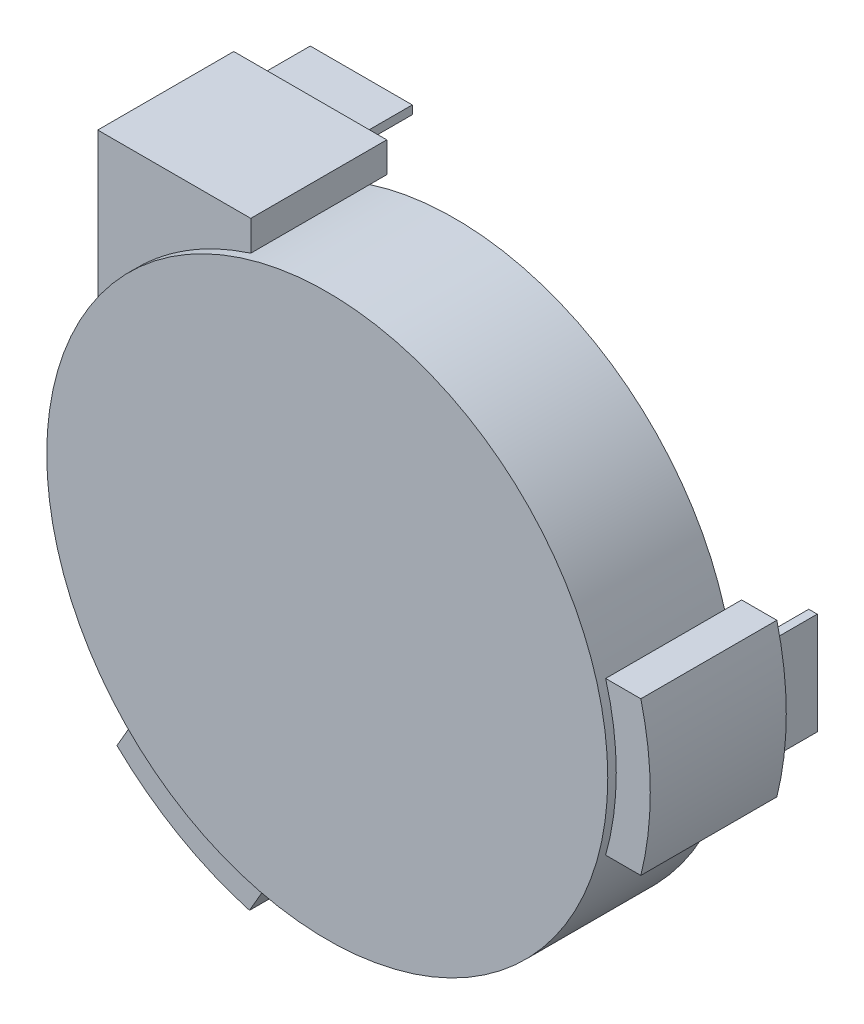
ISO-10303-21;
HEADER;
FILE_DESCRIPTION(('STEP AP214'),'2;1');
FILE_NAME('part.step','',(''),(''),'','','');
FILE_SCHEMA(('AUTOMOTIVE_DESIGN { 1 0 10303 214 1 1 1 1 }'));
ENDSEC;
DATA;
#1=APPLICATION_CONTEXT('core data for automotive mechanical design processes');
#2=APPLICATION_PROTOCOL_DEFINITION('international standard','automotive_design',2000,#1);
#3=PRODUCT_CONTEXT('',#1,'mechanical');
#4=PRODUCT('Part','Part','',(#3));
#5=PRODUCT_RELATED_PRODUCT_CATEGORY('part','',(#4));
#6=PRODUCT_DEFINITION_FORMATION('','',#4);
#7=PRODUCT_DEFINITION_CONTEXT('part definition',#1,'design');
#8=PRODUCT_DEFINITION('design','',#6,#7);
#9=PRODUCT_DEFINITION_SHAPE('','',#8);
#10=(LENGTH_UNIT() NAMED_UNIT(*) SI_UNIT(.MILLI.,.METRE.));
#11=(NAMED_UNIT(*) PLANE_ANGLE_UNIT() SI_UNIT($,.RADIAN.));
#12=(NAMED_UNIT(*) SI_UNIT($,.STERADIAN.) SOLID_ANGLE_UNIT());
#13=UNCERTAINTY_MEASURE_WITH_UNIT(LENGTH_MEASURE(1.E-05),#10,'distance_accuracy_value','');
#14=(GEOMETRIC_REPRESENTATION_CONTEXT(3) GLOBAL_UNCERTAINTY_ASSIGNED_CONTEXT((#13)) GLOBAL_UNIT_ASSIGNED_CONTEXT((#10,
#11,#12)) REPRESENTATION_CONTEXT('',''));
#15=CARTESIAN_POINT('',(0.,0.,0.));
#16=DIRECTION('',(0.,0.,1.));
#17=DIRECTION('',(1.,0.,0.));
#18=AXIS2_PLACEMENT_3D('',#15,#16,#17);
#19=CARTESIAN_POINT('',(-11.8343682502238,-11.4977270848675,-1.));
#20=DIRECTION('',(-0.866025403784437,0.500000000000003,0.));
#21=DIRECTION('',(-0.500000000000003,-0.866025403784437,0.));
#22=AXIS2_PLACEMENT_3D('',#19,#20,#21);
#23=PLANE('',#22);
#24=DIRECTION('',(-0.500000000000003,-0.866025403784437,0.));
#25=VECTOR('',#24,1.);
#26=CARTESIAN_POINT('',(-11.8343682502238,-11.4977270848675,7.));
#27=LINE('',#26,#25);
#28=CARTESIAN_POINT('',(-11.8343682502238,-11.4977270848675,7.));
#29=VERTEX_POINT('',#28);
#30=CARTESIAN_POINT('',(-12.8692935394932,-13.29027026792,7.));
#31=VERTEX_POINT('',#30);
#32=EDGE_CURVE('E12',#29,#31,#27,.T.);
#33=ORIENTED_EDGE('',*,*,#32,.F.);
#34=DIRECTION('',(0.,0.,1.));
#35=VECTOR('',#34,1.);
#36=CARTESIAN_POINT('',(-11.8343682502238,-11.4977270848675,-1.));
#37=LINE('',#36,#35);
#38=CARTESIAN_POINT('',(-11.8343682502238,-11.4977270848675,-1.));
#39=VERTEX_POINT('',#38);
#40=EDGE_CURVE('E95',#39,#29,#37,.T.);
#41=ORIENTED_EDGE('',*,*,#40,.F.);
#42=DIRECTION('',(-0.500000000000003,-0.866025403784437,0.));
#43=VECTOR('',#42,1.);
#44=CARTESIAN_POINT('',(-11.8343682502238,-11.4977270848675,-1.));
#45=LINE('',#44,#43);
#46=CARTESIAN_POINT('',(-12.8692935394932,-13.29027026792,-1.));
#47=VERTEX_POINT('',#46);
#48=EDGE_CURVE('E47',#39,#47,#45,.T.);
#49=ORIENTED_EDGE('',*,*,#48,.T.);
#50=DIRECTION('',(0.,0.,1.));
#51=VECTOR('',#50,1.);
#52=CARTESIAN_POINT('',(-12.8692935394932,-13.29027026792,-1.));
#53=LINE('',#52,#51);
#54=EDGE_CURVE('E69',#47,#31,#53,.T.);
#55=ORIENTED_EDGE('',*,*,#54,.T.);
#56=EDGE_LOOP('',(#33,#41,#49,#55));
#57=FACE_BOUND('',#56,.T.);
#58=ADVANCED_FACE('F43',(#57),#23,.T.);
#59=CARTESIAN_POINT('',(0.,0.,-1.));
#60=DIRECTION('',(0.,0.,1.));
#61=DIRECTION('',(1.,0.,0.));
#62=AXIS2_PLACEMENT_3D('',#59,#60,#61);
#63=CYLINDRICAL_SURFACE('',#62,16.5);
#64=CARTESIAN_POINT('',(0.,0.,7.));
#65=DIRECTION('',(0.,0.,1.));
#66=DIRECTION('',(1.,0.,0.));
#67=AXIS2_PLACEMENT_3D('',#64,#65,#66);
#68=CIRCLE('',#67,16.5);
#69=CARTESIAN_POINT('',(-4.04013961616387,-15.9977270848675,7.));
#70=VERTEX_POINT('',#69);
#71=EDGE_CURVE('E162',#29,#70,#68,.T.);
#72=ORIENTED_EDGE('',*,*,#71,.T.);
#73=DIRECTION('',(0.,0.,1.));
#74=VECTOR('',#73,1.);
#75=CARTESIAN_POINT('',(-4.04013961616387,-15.9977270848675,-1.));
#76=LINE('',#75,#74);
#77=CARTESIAN_POINT('',(-4.04013961616387,-15.9977270848675,-1.));
#78=VERTEX_POINT('',#77);
#79=EDGE_CURVE('E158',#78,#70,#76,.T.);
#80=ORIENTED_EDGE('',*,*,#79,.F.);
#81=CARTESIAN_POINT('',(0.,0.,-1.));
#82=DIRECTION('',(0.,0.,1.));
#83=DIRECTION('',(1.,0.,0.));
#84=AXIS2_PLACEMENT_3D('',#81,#82,#83);
#85=CIRCLE('',#84,16.5);
#86=EDGE_CURVE('E155',#39,#78,#85,.T.);
#87=ORIENTED_EDGE('',*,*,#86,.F.);
#88=ORIENTED_EDGE('',*,*,#40,.T.);
#89=EDGE_LOOP('',(#72,#80,#87,#88));
#90=FACE_BOUND('',#89,.T.);
#91=ADVANCED_FACE('F182',(#90),#63,.F.);
#92=CARTESIAN_POINT('',(-4.04013961616387,-15.9977270848675,-1.));
#93=DIRECTION('',(-0.866025403784437,0.500000000000003,0.));
#94=DIRECTION('',(-0.500000000000003,-0.866025403784437,0.));
#95=AXIS2_PLACEMENT_3D('',#92,#93,#94);
#96=PLANE('',#95);
#97=DIRECTION('',(-0.500000000000003,-0.866025403784437,0.));
#98=VECTOR('',#97,1.);
#99=CARTESIAN_POINT('',(-4.04013961616387,-15.9977270848675,7.));
#100=LINE('',#99,#98);
#101=CARTESIAN_POINT('',(-5.07506490543328,-17.79027026792,7.));
#102=VERTEX_POINT('',#101);
#103=EDGE_CURVE('E164',#70,#102,#100,.T.);
#104=ORIENTED_EDGE('',*,*,#103,.T.);
#105=DIRECTION('',(0.,0.,1.));
#106=VECTOR('',#105,1.);
#107=CARTESIAN_POINT('',(-5.07506490543328,-17.79027026792,-1.));
#108=LINE('',#107,#106);
#109=CARTESIAN_POINT('',(-5.07506490543328,-17.79027026792,-1.));
#110=VERTEX_POINT('',#109);
#111=EDGE_CURVE('E156',#110,#102,#108,.T.);
#112=ORIENTED_EDGE('',*,*,#111,.F.);
#113=DIRECTION('',(-0.500000000000003,-0.866025403784437,0.));
#114=VECTOR('',#113,1.);
#115=CARTESIAN_POINT('',(-4.04013961616387,-15.9977270848675,-1.));
#116=LINE('',#115,#114);
#117=EDGE_CURVE('E170',#78,#110,#116,.T.);
#118=ORIENTED_EDGE('',*,*,#117,.F.);
#119=ORIENTED_EDGE('',*,*,#79,.T.);
#120=EDGE_LOOP('',(#104,#112,#118,#119));
#121=FACE_BOUND('',#120,.T.);
#122=ADVANCED_FACE('F177',(#121),#96,.F.);
#123=CARTESIAN_POINT('',(0.,0.,-1.));
#124=DIRECTION('',(0.,0.,1.));
#125=DIRECTION('',(1.,0.,0.));
#126=AXIS2_PLACEMENT_3D('',#123,#124,#125);
#127=CYLINDRICAL_SURFACE('',#126,18.5);
#128=CARTESIAN_POINT('',(0.,0.,7.));
#129=DIRECTION('',(0.,0.,1.));
#130=DIRECTION('',(1.,0.,0.));
#131=AXIS2_PLACEMENT_3D('',#128,#129,#130);
#132=CIRCLE('',#131,18.5);
#133=EDGE_CURVE('E52',#31,#102,#132,.T.);
#134=ORIENTED_EDGE('',*,*,#133,.F.);
#135=ORIENTED_EDGE('',*,*,#54,.F.);
#136=CARTESIAN_POINT('',(0.,0.,-1.));
#137=DIRECTION('',(0.,0.,1.));
#138=DIRECTION('',(1.,0.,0.));
#139=AXIS2_PLACEMENT_3D('',#136,#137,#138);
#140=CIRCLE('',#139,18.5);
#141=EDGE_CURVE('E171',#47,#110,#140,.T.);
#142=ORIENTED_EDGE('',*,*,#141,.T.);
#143=ORIENTED_EDGE('',*,*,#111,.T.);
#144=EDGE_LOOP('',(#134,#135,#142,#143));
#145=FACE_BOUND('',#144,.T.);
#146=ADVANCED_FACE('F179',(#145),#127,.T.);
#147=CARTESIAN_POINT('',(0.,0.,-1.));
#148=DIRECTION('',(0.,0.,1.));
#149=DIRECTION('',(1.,0.,0.));
#150=AXIS2_PLACEMENT_3D('',#147,#148,#149);
#151=PLANE('',#150);
#152=DIRECTION('',(-0.866025403784436,0.500000000000004,0.));
#153=VECTOR('',#152,1.);
#154=CARTESIAN_POINT('',(-6.06274069732067,-16.5009749208748,-1.));
#155=LINE('',#154,#153);
#156=CARTESIAN_POINT('',(-6.06274069732067,-16.5009749208748,-1.));
#157=VERTEX_POINT('',#156);
#158=CARTESIAN_POINT('',(-11.2588931200273,-13.5009749208748,-1.));
#159=VERTEX_POINT('',#158);
#160=EDGE_CURVE('E124',#157,#159,#155,.T.);
#161=ORIENTED_EDGE('',*,*,#160,.F.);
#162=DIRECTION('',(0.500000000000001,0.866025403784438,0.));
#163=VECTOR('',#162,1.);
#164=CARTESIAN_POINT('',(-6.06274069732067,-16.5009749208748,-1.));
#165=LINE('',#164,#163);
#166=CARTESIAN_POINT('',(-5.81274069732067,-16.0679622189826,-1.));
#167=VERTEX_POINT('',#166);
#168=EDGE_CURVE('E132',#157,#167,#165,.T.);
#169=ORIENTED_EDGE('',*,*,#168,.T.);
#170=DIRECTION('',(-0.866025403784437,0.500000000000003,0.));
#171=VECTOR('',#170,1.);
#172=CARTESIAN_POINT('',(-5.81274069732067,-16.0679622189826,-1.));
#173=LINE('',#172,#171);
#174=CARTESIAN_POINT('',(-11.0088931200273,-13.0679622189826,-1.));
#175=VERTEX_POINT('',#174);
#176=EDGE_CURVE('E138',#167,#175,#173,.T.);
#177=ORIENTED_EDGE('',*,*,#176,.T.);
#178=DIRECTION('',(0.500000000000002,0.866025403784438,0.));
#179=VECTOR('',#178,1.);
#180=CARTESIAN_POINT('',(-11.2588931200273,-13.5009749208748,-1.));
#181=LINE('',#180,#179);
#182=EDGE_CURVE('E60',#159,#175,#181,.T.);
#183=ORIENTED_EDGE('',*,*,#182,.F.);
#184=EDGE_LOOP('',(#161,#169,#177,#183));
#185=FACE_BOUND('',#184,.T.);
#186=ORIENTED_EDGE('',*,*,#48,.F.);
#187=ORIENTED_EDGE('',*,*,#86,.T.);
#188=ORIENTED_EDGE('',*,*,#117,.T.);
#189=ORIENTED_EDGE('',*,*,#141,.F.);
#190=EDGE_LOOP('',(#186,#187,#188,#189));
#191=FACE_BOUND('',#190,.T.);
#192=ADVANCED_FACE('F45',(#185,#191),#151,.F.);
#193=CARTESIAN_POINT('',(0.,0.,7.));
#194=DIRECTION('',(0.,0.,1.));
#195=DIRECTION('',(1.,0.,0.));
#196=AXIS2_PLACEMENT_3D('',#193,#194,#195);
#197=PLANE('',#196);
#198=ORIENTED_EDGE('',*,*,#32,.T.);
#199=ORIENTED_EDGE('',*,*,#133,.T.);
#200=ORIENTED_EDGE('',*,*,#103,.F.);
#201=ORIENTED_EDGE('',*,*,#71,.F.);
#202=EDGE_LOOP('',(#198,#199,#200,#201));
#203=FACE_BOUND('',#202,.T.);
#204=ADVANCED_FACE('F181',(#203),#197,.T.);
#205=CARTESIAN_POINT('',(-6.06274069732067,-16.5009749208748,-4.));
#206=DIRECTION('',(0.866025403784438,-0.500000000000001,0.));
#207=DIRECTION('',(0.500000000000001,0.866025403784438,0.));
#208=AXIS2_PLACEMENT_3D('',#205,#206,#207);
#209=PLANE('',#208);
#210=ORIENTED_EDGE('',*,*,#168,.F.);
#211=DIRECTION('',(0.,0.,1.));
#212=VECTOR('',#211,1.);
#213=CARTESIAN_POINT('',(-6.06274069732067,-16.5009749208748,-4.));
#214=LINE('',#213,#212);
#215=CARTESIAN_POINT('',(-6.06274069732067,-16.5009749208748,-4.));
#216=VERTEX_POINT('',#215);
#217=EDGE_CURVE('E119',#216,#157,#214,.T.);
#218=ORIENTED_EDGE('',*,*,#217,.F.);
#219=DIRECTION('',(0.500000000000001,0.866025403784438,0.));
#220=VECTOR('',#219,1.);
#221=CARTESIAN_POINT('',(-6.06274069732067,-16.5009749208748,-4.));
#222=LINE('',#221,#220);
#223=CARTESIAN_POINT('',(-5.81274069732067,-16.0679622189826,-4.));
#224=VERTEX_POINT('',#223);
#225=EDGE_CURVE('E141',#216,#224,#222,.T.);
#226=ORIENTED_EDGE('',*,*,#225,.T.);
#227=DIRECTION('',(0.,0.,1.));
#228=VECTOR('',#227,1.);
#229=CARTESIAN_POINT('',(-5.81274069732067,-16.0679622189826,-4.));
#230=LINE('',#229,#228);
#231=EDGE_CURVE('E134',#224,#167,#230,.T.);
#232=ORIENTED_EDGE('',*,*,#231,.T.);
#233=EDGE_LOOP('',(#210,#218,#226,#232));
#234=FACE_BOUND('',#233,.T.);
#235=ADVANCED_FACE('F133',(#234),#209,.T.);
#236=CARTESIAN_POINT('',(-6.06274069732067,-16.5009749208748,-4.));
#237=DIRECTION('',(0.500000000000004,0.866025403784436,0.));
#238=DIRECTION('',(-0.866025403784437,0.500000000000004,0.));
#239=AXIS2_PLACEMENT_3D('',#236,#237,#238);
#240=PLANE('',#239);
#241=ORIENTED_EDGE('',*,*,#160,.T.);
#242=DIRECTION('',(0.,0.,1.));
#243=VECTOR('',#242,1.);
#244=CARTESIAN_POINT('',(-11.2588931200273,-13.5009749208748,-4.));
#245=LINE('',#244,#243);
#246=CARTESIAN_POINT('',(-11.2588931200273,-13.5009749208748,-4.));
#247=VERTEX_POINT('',#246);
#248=EDGE_CURVE('E129',#247,#159,#245,.T.);
#249=ORIENTED_EDGE('',*,*,#248,.F.);
#250=DIRECTION('',(-0.866025403784436,0.500000000000004,0.));
#251=VECTOR('',#250,1.);
#252=CARTESIAN_POINT('',(-6.06274069732067,-16.5009749208748,-4.));
#253=LINE('',#252,#251);
#254=EDGE_CURVE('E125',#216,#247,#253,.T.);
#255=ORIENTED_EDGE('',*,*,#254,.F.);
#256=ORIENTED_EDGE('',*,*,#217,.T.);
#257=EDGE_LOOP('',(#241,#249,#255,#256));
#258=FACE_BOUND('',#257,.T.);
#259=ADVANCED_FACE('F121',(#258),#240,.F.);
#260=CARTESIAN_POINT('',(-11.2588931200273,-13.5009749208748,-4.));
#261=DIRECTION('',(0.866025403784438,-0.500000000000002,0.));
#262=DIRECTION('',(0.500000000000002,0.866025403784438,0.));
#263=AXIS2_PLACEMENT_3D('',#260,#261,#262);
#264=PLANE('',#263);
#265=ORIENTED_EDGE('',*,*,#182,.T.);
#266=DIRECTION('',(0.,0.,1.));
#267=VECTOR('',#266,1.);
#268=CARTESIAN_POINT('',(-11.0088931200273,-13.0679622189826,-4.));
#269=LINE('',#268,#267);
#270=CARTESIAN_POINT('',(-11.0088931200273,-13.0679622189826,-4.));
#271=VERTEX_POINT('',#270);
#272=EDGE_CURVE('E219',#271,#175,#269,.T.);
#273=ORIENTED_EDGE('',*,*,#272,.F.);
#274=DIRECTION('',(0.500000000000002,0.866025403784438,0.));
#275=VECTOR('',#274,1.);
#276=CARTESIAN_POINT('',(-11.2588931200273,-13.5009749208748,-4.));
#277=LINE('',#276,#275);
#278=EDGE_CURVE('E150',#247,#271,#277,.T.);
#279=ORIENTED_EDGE('',*,*,#278,.F.);
#280=ORIENTED_EDGE('',*,*,#248,.T.);
#281=EDGE_LOOP('',(#265,#273,#279,#280));
#282=FACE_BOUND('',#281,.T.);
#283=ADVANCED_FACE('F211',(#282),#264,.F.);
#284=CARTESIAN_POINT('',(-5.81274069732067,-16.0679622189826,-4.));
#285=DIRECTION('',(0.500000000000003,0.866025403784437,0.));
#286=DIRECTION('',(-0.866025403784437,0.500000000000003,0.));
#287=AXIS2_PLACEMENT_3D('',#284,#285,#286);
#288=PLANE('',#287);
#289=ORIENTED_EDGE('',*,*,#176,.F.);
#290=ORIENTED_EDGE('',*,*,#231,.F.);
#291=DIRECTION('',(-0.866025403784437,0.500000000000003,0.));
#292=VECTOR('',#291,1.);
#293=CARTESIAN_POINT('',(-5.81274069732067,-16.0679622189826,-4.));
#294=LINE('',#293,#292);
#295=EDGE_CURVE('E144',#224,#271,#294,.T.);
#296=ORIENTED_EDGE('',*,*,#295,.T.);
#297=ORIENTED_EDGE('',*,*,#272,.T.);
#298=EDGE_LOOP('',(#289,#290,#296,#297));
#299=FACE_BOUND('',#298,.T.);
#300=ADVANCED_FACE('F207',(#299),#288,.T.);
#301=CARTESIAN_POINT('',(-5.81274069732067,-16.0679622189826,-4.));
#302=DIRECTION('',(0.,0.,1.));
#303=DIRECTION('',(1.,0.,0.));
#304=AXIS2_PLACEMENT_3D('',#301,#302,#303);
#305=PLANE('',#304);
#306=ORIENTED_EDGE('',*,*,#225,.F.);
#307=ORIENTED_EDGE('',*,*,#254,.T.);
#308=ORIENTED_EDGE('',*,*,#278,.T.);
#309=ORIENTED_EDGE('',*,*,#295,.F.);
#310=EDGE_LOOP('',(#306,#307,#308,#309));
#311=FACE_BOUND('',#310,.T.);
#312=ADVANCED_FACE('F204',(#311),#305,.F.);
#313=CLOSED_SHELL('',(#58,#91,#122,#146,#192,#204,#235,#259,#283,#300,#312));
#314=MANIFOLD_SOLID_BREP('B2',#313);
#315=CARTESIAN_POINT('',(15.8745078663875,-4.5,-1.));
#316=DIRECTION('',(0.,-1.,0.));
#317=DIRECTION('',(0.,0.,-1.));
#318=AXIS2_PLACEMENT_3D('',#315,#316,#317);
#319=PLANE('',#318);
#320=DIRECTION('',(1.,0.,0.));
#321=VECTOR('',#320,1.);
#322=CARTESIAN_POINT('',(15.8745078663875,-4.5,7.));
#323=LINE('',#322,#321);
#324=CARTESIAN_POINT('',(15.8745078663875,-4.50000000000001,7.));
#325=VERTEX_POINT('',#324);
#326=CARTESIAN_POINT('',(17.9443584449264,-4.50000000000001,7.));
#327=VERTEX_POINT('',#326);
#328=EDGE_CURVE('E41',#325,#327,#323,.T.);
#329=ORIENTED_EDGE('',*,*,#328,.F.);
#330=DIRECTION('',(0.,0.,1.));
#331=VECTOR('',#330,1.);
#332=CARTESIAN_POINT('',(15.8745078663875,-4.50000000000001,-1.));
#333=LINE('',#332,#331);
#334=CARTESIAN_POINT('',(15.8745078663875,-4.50000000000001,-1.));
#335=VERTEX_POINT('',#334);
#336=EDGE_CURVE('E343',#335,#325,#333,.T.);
#337=ORIENTED_EDGE('',*,*,#336,.F.);
#338=DIRECTION('',(1.,0.,0.));
#339=VECTOR('',#338,1.);
#340=CARTESIAN_POINT('',(15.8745078663875,-4.5,-1.));
#341=LINE('',#340,#339);
#342=CARTESIAN_POINT('',(17.9443584449264,-4.50000000000001,-1.));
#343=VERTEX_POINT('',#342);
#344=EDGE_CURVE('E295',#335,#343,#341,.T.);
#345=ORIENTED_EDGE('',*,*,#344,.T.);
#346=DIRECTION('',(0.,0.,1.));
#347=VECTOR('',#346,1.);
#348=CARTESIAN_POINT('',(17.9443584449264,-4.50000000000001,-1.));
#349=LINE('',#348,#347);
#350=EDGE_CURVE('E317',#343,#327,#349,.T.);
#351=ORIENTED_EDGE('',*,*,#350,.T.);
#352=EDGE_LOOP('',(#329,#337,#345,#351));
#353=FACE_BOUND('',#352,.T.);
#354=ADVANCED_FACE('F291',(#353),#319,.T.);
#355=CARTESIAN_POINT('',(0.,0.,-1.));
#356=DIRECTION('',(0.,0.,1.));
#357=DIRECTION('',(1.,0.,0.));
#358=AXIS2_PLACEMENT_3D('',#355,#356,#357);
#359=CYLINDRICAL_SURFACE('',#358,16.5);
#360=CARTESIAN_POINT('',(0.,0.,7.));
#361=DIRECTION('',(0.,0.,1.));
#362=DIRECTION('',(1.,0.,0.));
#363=AXIS2_PLACEMENT_3D('',#360,#361,#362);
#364=CIRCLE('',#363,16.5);
#365=CARTESIAN_POINT('',(15.8745078663875,4.50000000000001,7.));
#366=VERTEX_POINT('',#365);
#367=EDGE_CURVE('E410',#325,#366,#364,.T.);
#368=ORIENTED_EDGE('',*,*,#367,.T.);
#369=DIRECTION('',(0.,0.,1.));
#370=VECTOR('',#369,1.);
#371=CARTESIAN_POINT('',(15.8745078663875,4.50000000000001,-1.));
#372=LINE('',#371,#370);
#373=CARTESIAN_POINT('',(15.8745078663875,4.50000000000001,-1.));
#374=VERTEX_POINT('',#373);
#375=EDGE_CURVE('E406',#374,#366,#372,.T.);
#376=ORIENTED_EDGE('',*,*,#375,.F.);
#377=CARTESIAN_POINT('',(0.,0.,-1.));
#378=DIRECTION('',(0.,0.,1.));
#379=DIRECTION('',(1.,0.,0.));
#380=AXIS2_PLACEMENT_3D('',#377,#378,#379);
#381=CIRCLE('',#380,16.5);
#382=EDGE_CURVE('E403',#335,#374,#381,.T.);
#383=ORIENTED_EDGE('',*,*,#382,.F.);
#384=ORIENTED_EDGE('',*,*,#336,.T.);
#385=EDGE_LOOP('',(#368,#376,#383,#384));
#386=FACE_BOUND('',#385,.T.);
#387=ADVANCED_FACE('F430',(#386),#359,.F.);
#388=CARTESIAN_POINT('',(15.8745078663875,4.5,-1.));
#389=DIRECTION('',(0.,-1.,0.));
#390=DIRECTION('',(0.,0.,-1.));
#391=AXIS2_PLACEMENT_3D('',#388,#389,#390);
#392=PLANE('',#391);
#393=DIRECTION('',(1.,0.,0.));
#394=VECTOR('',#393,1.);
#395=CARTESIAN_POINT('',(15.8745078663875,4.5,7.));
#396=LINE('',#395,#394);
#397=CARTESIAN_POINT('',(17.9443584449264,4.5,7.));
#398=VERTEX_POINT('',#397);
#399=EDGE_CURVE('E412',#366,#398,#396,.T.);
#400=ORIENTED_EDGE('',*,*,#399,.T.);
#401=DIRECTION('',(0.,0.,1.));
#402=VECTOR('',#401,1.);
#403=CARTESIAN_POINT('',(17.9443584449264,4.5,-1.));
#404=LINE('',#403,#402);
#405=CARTESIAN_POINT('',(17.9443584449264,4.5,-1.));
#406=VERTEX_POINT('',#405);
#407=EDGE_CURVE('E404',#406,#398,#404,.T.);
#408=ORIENTED_EDGE('',*,*,#407,.F.);
#409=DIRECTION('',(1.,0.,0.));
#410=VECTOR('',#409,1.);
#411=CARTESIAN_POINT('',(15.8745078663875,4.5,-1.));
#412=LINE('',#411,#410);
#413=EDGE_CURVE('E418',#374,#406,#412,.T.);
#414=ORIENTED_EDGE('',*,*,#413,.F.);
#415=ORIENTED_EDGE('',*,*,#375,.T.);
#416=EDGE_LOOP('',(#400,#408,#414,#415));
#417=FACE_BOUND('',#416,.T.);
#418=ADVANCED_FACE('F425',(#417),#392,.F.);
#419=CARTESIAN_POINT('',(0.,0.,-1.));
#420=DIRECTION('',(0.,0.,1.));
#421=DIRECTION('',(1.,0.,0.));
#422=AXIS2_PLACEMENT_3D('',#419,#420,#421);
#423=CYLINDRICAL_SURFACE('',#422,18.5);
#424=CARTESIAN_POINT('',(0.,0.,7.));
#425=DIRECTION('',(0.,0.,1.));
#426=DIRECTION('',(1.,0.,0.));
#427=AXIS2_PLACEMENT_3D('',#424,#425,#426);
#428=CIRCLE('',#427,18.5);
#429=EDGE_CURVE('E300',#327,#398,#428,.T.);
#430=ORIENTED_EDGE('',*,*,#429,.F.);
#431=ORIENTED_EDGE('',*,*,#350,.F.);
#432=CARTESIAN_POINT('',(0.,0.,-1.));
#433=DIRECTION('',(0.,0.,1.));
#434=DIRECTION('',(1.,0.,0.));
#435=AXIS2_PLACEMENT_3D('',#432,#433,#434);
#436=CIRCLE('',#435,18.5);
#437=EDGE_CURVE('E419',#343,#406,#436,.T.);
#438=ORIENTED_EDGE('',*,*,#437,.T.);
#439=ORIENTED_EDGE('',*,*,#407,.T.);
#440=EDGE_LOOP('',(#430,#431,#438,#439));
#441=FACE_BOUND('',#440,.T.);
#442=ADVANCED_FACE('F427',(#441),#423,.T.);
#443=CARTESIAN_POINT('',(0.,0.,-1.));
#444=DIRECTION('',(0.,0.,1.));
#445=DIRECTION('',(1.,0.,0.));
#446=AXIS2_PLACEMENT_3D('',#443,#444,#445);
#447=PLANE('',#446);
#448=DIRECTION('',(0.,-1.,0.));
#449=VECTOR('',#448,1.);
#450=CARTESIAN_POINT('',(17.3216338173478,3.,-1.));
#451=LINE('',#450,#449);
#452=CARTESIAN_POINT('',(17.3216338173478,3.,-1.));
#453=VERTEX_POINT('',#452);
#454=CARTESIAN_POINT('',(17.3216338173478,-3.,-1.));
#455=VERTEX_POINT('',#454);
#456=EDGE_CURVE('E372',#453,#455,#451,.T.);
#457=ORIENTED_EDGE('',*,*,#456,.F.);
#458=DIRECTION('',(-1.,0.,0.));
#459=VECTOR('',#458,1.);
#460=CARTESIAN_POINT('',(17.3216338173478,3.,-1.));
#461=LINE('',#460,#459);
#462=CARTESIAN_POINT('',(16.8216338173478,3.,-1.));
#463=VERTEX_POINT('',#462);
#464=EDGE_CURVE('E380',#453,#463,#461,.T.);
#465=ORIENTED_EDGE('',*,*,#464,.T.);
#466=DIRECTION('',(0.,-1.,0.));
#467=VECTOR('',#466,1.);
#468=CARTESIAN_POINT('',(16.8216338173478,3.,-1.));
#469=LINE('',#468,#467);
#470=CARTESIAN_POINT('',(16.8216338173478,-3.,-1.));
#471=VERTEX_POINT('',#470);
#472=EDGE_CURVE('E386',#463,#471,#469,.T.);
#473=ORIENTED_EDGE('',*,*,#472,.T.);
#474=DIRECTION('',(-1.,0.,0.));
#475=VECTOR('',#474,1.);
#476=CARTESIAN_POINT('',(17.3216338173478,-3.,-1.));
#477=LINE('',#476,#475);
#478=EDGE_CURVE('E308',#455,#471,#477,.T.);
#479=ORIENTED_EDGE('',*,*,#478,.F.);
#480=EDGE_LOOP('',(#457,#465,#473,#479));
#481=FACE_BOUND('',#480,.T.);
#482=ORIENTED_EDGE('',*,*,#344,.F.);
#483=ORIENTED_EDGE('',*,*,#382,.T.);
#484=ORIENTED_EDGE('',*,*,#413,.T.);
#485=ORIENTED_EDGE('',*,*,#437,.F.);
#486=EDGE_LOOP('',(#482,#483,#484,#485));
#487=FACE_BOUND('',#486,.T.);
#488=ADVANCED_FACE('F293',(#481,#487),#447,.F.);
#489=CARTESIAN_POINT('',(0.,0.,7.));
#490=DIRECTION('',(0.,0.,1.));
#491=DIRECTION('',(1.,0.,0.));
#492=AXIS2_PLACEMENT_3D('',#489,#490,#491);
#493=PLANE('',#492);
#494=ORIENTED_EDGE('',*,*,#328,.T.);
#495=ORIENTED_EDGE('',*,*,#429,.T.);
#496=ORIENTED_EDGE('',*,*,#399,.F.);
#497=ORIENTED_EDGE('',*,*,#367,.F.);
#498=EDGE_LOOP('',(#494,#495,#496,#497));
#499=FACE_BOUND('',#498,.T.);
#500=ADVANCED_FACE('F429',(#499),#493,.T.);
#501=CARTESIAN_POINT('',(17.3216338173478,3.,-4.));
#502=DIRECTION('',(0.,1.,0.));
#503=DIRECTION('',(0.,0.,1.));
#504=AXIS2_PLACEMENT_3D('',#501,#502,#503);
#505=PLANE('',#504);
#506=ORIENTED_EDGE('',*,*,#464,.F.);
#507=DIRECTION('',(0.,0.,1.));
#508=VECTOR('',#507,1.);
#509=CARTESIAN_POINT('',(17.3216338173478,3.,-4.));
#510=LINE('',#509,#508);
#511=CARTESIAN_POINT('',(17.3216338173478,3.,-4.));
#512=VERTEX_POINT('',#511);
#513=EDGE_CURVE('E367',#512,#453,#510,.T.);
#514=ORIENTED_EDGE('',*,*,#513,.F.);
#515=DIRECTION('',(-1.,0.,0.));
#516=VECTOR('',#515,1.);
#517=CARTESIAN_POINT('',(17.3216338173478,3.,-4.));
#518=LINE('',#517,#516);
#519=CARTESIAN_POINT('',(16.8216338173478,3.,-4.));
#520=VERTEX_POINT('',#519);
#521=EDGE_CURVE('E389',#512,#520,#518,.T.);
#522=ORIENTED_EDGE('',*,*,#521,.T.);
#523=DIRECTION('',(0.,0.,1.));
#524=VECTOR('',#523,1.);
#525=CARTESIAN_POINT('',(16.8216338173478,3.,-4.));
#526=LINE('',#525,#524);
#527=EDGE_CURVE('E382',#520,#463,#526,.T.);
#528=ORIENTED_EDGE('',*,*,#527,.T.);
#529=EDGE_LOOP('',(#506,#514,#522,#528));
#530=FACE_BOUND('',#529,.T.);
#531=ADVANCED_FACE('F381',(#530),#505,.T.);
#532=CARTESIAN_POINT('',(17.3216338173478,3.,-4.));
#533=DIRECTION('',(-1.,0.,0.));
#534=DIRECTION('',(0.,0.,1.));
#535=AXIS2_PLACEMENT_3D('',#532,#533,#534);
#536=PLANE('',#535);
#537=ORIENTED_EDGE('',*,*,#456,.T.);
#538=DIRECTION('',(0.,0.,1.));
#539=VECTOR('',#538,1.);
#540=CARTESIAN_POINT('',(17.3216338173478,-3.,-4.));
#541=LINE('',#540,#539);
#542=CARTESIAN_POINT('',(17.3216338173478,-3.,-4.));
#543=VERTEX_POINT('',#542);
#544=EDGE_CURVE('E377',#543,#455,#541,.T.);
#545=ORIENTED_EDGE('',*,*,#544,.F.);
#546=DIRECTION('',(0.,-1.,0.));
#547=VECTOR('',#546,1.);
#548=CARTESIAN_POINT('',(17.3216338173478,3.,-4.));
#549=LINE('',#548,#547);
#550=EDGE_CURVE('E373',#512,#543,#549,.T.);
#551=ORIENTED_EDGE('',*,*,#550,.F.);
#552=ORIENTED_EDGE('',*,*,#513,.T.);
#553=EDGE_LOOP('',(#537,#545,#551,#552));
#554=FACE_BOUND('',#553,.T.);
#555=ADVANCED_FACE('F369',(#554),#536,.F.);
#556=CARTESIAN_POINT('',(17.3216338173478,-3.,-4.));
#557=DIRECTION('',(0.,1.,0.));
#558=DIRECTION('',(-1.,0.,0.));
#559=AXIS2_PLACEMENT_3D('',#556,#557,#558);
#560=PLANE('',#559);
#561=ORIENTED_EDGE('',*,*,#478,.T.);
#562=DIRECTION('',(0.,0.,1.));
#563=VECTOR('',#562,1.);
#564=CARTESIAN_POINT('',(16.8216338173478,-3.,-4.));
#565=LINE('',#564,#563);
#566=CARTESIAN_POINT('',(16.8216338173478,-3.,-4.));
#567=VERTEX_POINT('',#566);
#568=EDGE_CURVE('E467',#567,#471,#565,.T.);
#569=ORIENTED_EDGE('',*,*,#568,.F.);
#570=DIRECTION('',(-1.,0.,0.));
#571=VECTOR('',#570,1.);
#572=CARTESIAN_POINT('',(17.3216338173478,-3.,-4.));
#573=LINE('',#572,#571);
#574=EDGE_CURVE('E398',#543,#567,#573,.T.);
#575=ORIENTED_EDGE('',*,*,#574,.F.);
#576=ORIENTED_EDGE('',*,*,#544,.T.);
#577=EDGE_LOOP('',(#561,#569,#575,#576));
#578=FACE_BOUND('',#577,.T.);
#579=ADVANCED_FACE('F459',(#578),#560,.F.);
#580=CARTESIAN_POINT('',(16.8216338173478,3.,-4.));
#581=DIRECTION('',(-1.,0.,0.));
#582=DIRECTION('',(0.,0.,1.));
#583=AXIS2_PLACEMENT_3D('',#580,#581,#582);
#584=PLANE('',#583);
#585=ORIENTED_EDGE('',*,*,#472,.F.);
#586=ORIENTED_EDGE('',*,*,#527,.F.);
#587=DIRECTION('',(0.,-1.,0.));
#588=VECTOR('',#587,1.);
#589=CARTESIAN_POINT('',(16.8216338173478,3.,-4.));
#590=LINE('',#589,#588);
#591=EDGE_CURVE('E392',#520,#567,#590,.T.);
#592=ORIENTED_EDGE('',*,*,#591,.T.);
#593=ORIENTED_EDGE('',*,*,#568,.T.);
#594=EDGE_LOOP('',(#585,#586,#592,#593));
#595=FACE_BOUND('',#594,.T.);
#596=ADVANCED_FACE('F455',(#595),#584,.T.);
#597=CARTESIAN_POINT('',(16.8216338173478,3.,-4.));
#598=DIRECTION('',(0.,0.,1.));
#599=DIRECTION('',(1.,0.,0.));
#600=AXIS2_PLACEMENT_3D('',#597,#598,#599);
#601=PLANE('',#600);
#602=ORIENTED_EDGE('',*,*,#521,.F.);
#603=ORIENTED_EDGE('',*,*,#550,.T.);
#604=ORIENTED_EDGE('',*,*,#574,.T.);
#605=ORIENTED_EDGE('',*,*,#591,.F.);
#606=EDGE_LOOP('',(#602,#603,#604,#605));
#607=FACE_BOUND('',#606,.T.);
#608=ADVANCED_FACE('F452',(#607),#601,.F.);
#609=CLOSED_SHELL('',(#354,#387,#418,#442,#488,#500,#531,#555,#579,#596,#608));
#610=MANIFOLD_SOLID_BREP('B6',#609);
#611=CARTESIAN_POINT('',(0.,0.,-1.));
#612=DIRECTION('',(0.,0.,1.));
#613=DIRECTION('',(1.,0.,0.));
#614=AXIS2_PLACEMENT_3D('',#611,#612,#613);
#615=PLANE('',#614);
#616=DIRECTION('',(0.,1.,0.));
#617=VECTOR('',#616,1.);
#618=CARTESIAN_POINT('',(-4.99999999999999,15.7241851935164,-1.));
#619=LINE('',#618,#617);
#620=CARTESIAN_POINT('',(-4.99999999999999,15.7241851935164,-1.));
#621=VERTEX_POINT('',#620);
#622=CARTESIAN_POINT('',(-4.99999999999999,17.5,-1.));
#623=VERTEX_POINT('',#622);
#624=EDGE_CURVE('E645',#621,#623,#619,.T.);
#625=ORIENTED_EDGE('',*,*,#624,.F.);
#626=CARTESIAN_POINT('',(0.,0.,-1.));
#627=DIRECTION('',(0.,0.,1.));
#628=DIRECTION('',(1.,0.,0.));
#629=AXIS2_PLACEMENT_3D('',#626,#627,#628);
#630=CIRCLE('',#629,16.5);
#631=CARTESIAN_POINT('',(-14.,8.7321245982865,-1.));
#632=VERTEX_POINT('',#631);
#633=EDGE_CURVE('E652',#621,#632,#630,.T.);
#634=ORIENTED_EDGE('',*,*,#633,.T.);
#635=DIRECTION('',(0.,-1.,0.));
#636=VECTOR('',#635,1.);
#637=CARTESIAN_POINT('',(-14.,17.5,-1.));
#638=LINE('',#637,#636);
#639=CARTESIAN_POINT('',(-14.,17.5,-1.));
#640=VERTEX_POINT('',#639);
#641=EDGE_CURVE('E649',#640,#632,#638,.T.);
#642=ORIENTED_EDGE('',*,*,#641,.F.);
#643=DIRECTION('',(1.,0.,0.));
#644=VECTOR('',#643,1.);
#645=CARTESIAN_POINT('',(-14.,17.5,-1.));
#646=LINE('',#645,#644);
#647=EDGE_CURVE('E587',#640,#623,#646,.T.);
#648=ORIENTED_EDGE('',*,*,#647,.T.);
#649=EDGE_LOOP('',(#625,#634,#642,#648));
#650=FACE_BOUND('',#649,.T.);
#651=DIRECTION('',(0.,-1.,0.));
#652=VECTOR('',#651,1.);
#653=CARTESIAN_POINT('',(-6.5,17.0296768724105,-1.));
#654=LINE('',#653,#652);
#655=CARTESIAN_POINT('',(-6.5,17.0296768724105,-1.));
#656=VERTEX_POINT('',#655);
#657=CARTESIAN_POINT('',(-6.5,16.5296768724105,-1.));
#658=VERTEX_POINT('',#657);
#659=EDGE_CURVE('E634',#656,#658,#654,.T.);
#660=ORIENTED_EDGE('',*,*,#659,.F.);
#661=DIRECTION('',(-1.,0.,0.));
#662=VECTOR('',#661,1.);
#663=CARTESIAN_POINT('',(-6.5,17.0296768724105,-1.));
#664=LINE('',#663,#662);
#665=CARTESIAN_POINT('',(-12.5,17.0296768724105,-1.));
#666=VERTEX_POINT('',#665);
#667=EDGE_CURVE('E630',#656,#666,#664,.T.);
#668=ORIENTED_EDGE('',*,*,#667,.T.);
#669=DIRECTION('',(0.,-1.,0.));
#670=VECTOR('',#669,1.);
#671=CARTESIAN_POINT('',(-12.5,17.0296768724105,-1.));
#672=LINE('',#671,#670);
#673=CARTESIAN_POINT('',(-12.5,16.5296768724105,-1.));
#674=VERTEX_POINT('',#673);
#675=EDGE_CURVE('E553',#666,#674,#672,.T.);
#676=ORIENTED_EDGE('',*,*,#675,.T.);
#677=DIRECTION('',(-1.,0.,0.));
#678=VECTOR('',#677,1.);
#679=CARTESIAN_POINT('',(-6.5,16.5296768724105,-1.));
#680=LINE('',#679,#678);
#681=EDGE_CURVE('E676',#658,#674,#680,.T.);
#682=ORIENTED_EDGE('',*,*,#681,.F.);
#683=EDGE_LOOP('',(#660,#668,#676,#682));
#684=FACE_BOUND('',#683,.T.);
#685=ADVANCED_FACE('F536',(#650,#684),#615,.F.);
#686=CARTESIAN_POINT('',(-4.99999999999999,15.7241851935164,-1.));
#687=DIRECTION('',(1.,0.,0.));
#688=DIRECTION('',(0.,0.,-1.));
#689=AXIS2_PLACEMENT_3D('',#686,#687,#688);
#690=PLANE('',#689);
#691=DIRECTION('',(0.,1.,0.));
#692=VECTOR('',#691,1.);
#693=CARTESIAN_POINT('',(-4.99999999999999,15.7241851935164,7.));
#694=LINE('',#693,#692);
#695=CARTESIAN_POINT('',(-4.99999999999999,15.7241851935164,7.));
#696=VERTEX_POINT('',#695);
#697=CARTESIAN_POINT('',(-4.99999999999999,17.5,7.));
#698=VERTEX_POINT('',#697);
#699=EDGE_CURVE('E636',#696,#698,#694,.T.);
#700=ORIENTED_EDGE('',*,*,#699,.F.);
#701=DIRECTION('',(0.,0.,1.));
#702=VECTOR('',#701,1.);
#703=CARTESIAN_POINT('',(-4.99999999999999,15.7241851935164,-1.));
#704=LINE('',#703,#702);
#705=EDGE_CURVE('E289',#621,#696,#704,.T.);
#706=ORIENTED_EDGE('',*,*,#705,.F.);
#707=ORIENTED_EDGE('',*,*,#624,.T.);
#708=DIRECTION('',(0.,0.,1.));
#709=VECTOR('',#708,1.);
#710=CARTESIAN_POINT('',(-4.99999999999999,17.5,-1.));
#711=LINE('',#710,#709);
#712=EDGE_CURVE('E540',#623,#698,#711,.T.);
#713=ORIENTED_EDGE('',*,*,#712,.T.);
#714=EDGE_LOOP('',(#700,#706,#707,#713));
#715=FACE_BOUND('',#714,.T.);
#716=ADVANCED_FACE('F538',(#715),#690,.T.);
#717=CARTESIAN_POINT('',(0.,0.,-1.));
#718=DIRECTION('',(0.,0.,1.));
#719=DIRECTION('',(1.,0.,0.));
#720=AXIS2_PLACEMENT_3D('',#717,#718,#719);
#721=CYLINDRICAL_SURFACE('',#720,16.5);
#722=CARTESIAN_POINT('',(0.,0.,7.));
#723=DIRECTION('',(0.,0.,1.));
#724=DIRECTION('',(1.,0.,0.));
#725=AXIS2_PLACEMENT_3D('',#722,#723,#724);
#726=CIRCLE('',#725,16.5);
#727=CARTESIAN_POINT('',(-14.,8.7321245982865,7.));
#728=VERTEX_POINT('',#727);
#729=EDGE_CURVE('E647',#696,#728,#726,.T.);
#730=ORIENTED_EDGE('',*,*,#729,.T.);
#731=DIRECTION('',(0.,0.,1.));
#732=VECTOR('',#731,1.);
#733=CARTESIAN_POINT('',(-14.,8.7321245982865,-1.));
#734=LINE('',#733,#732);
#735=EDGE_CURVE('E545',#632,#728,#734,.T.);
#736=ORIENTED_EDGE('',*,*,#735,.F.);
#737=ORIENTED_EDGE('',*,*,#633,.F.);
#738=ORIENTED_EDGE('',*,*,#705,.T.);
#739=EDGE_LOOP('',(#730,#736,#737,#738));
#740=FACE_BOUND('',#739,.T.);
#741=ADVANCED_FACE('F668',(#740),#721,.F.);
#742=CARTESIAN_POINT('',(-14.,17.5,-1.));
#743=DIRECTION('',(-1.,0.,0.));
#744=DIRECTION('',(0.,-1.,0.));
#745=AXIS2_PLACEMENT_3D('',#742,#743,#744);
#746=PLANE('',#745);
#747=DIRECTION('',(0.,-1.,0.));
#748=VECTOR('',#747,1.);
#749=CARTESIAN_POINT('',(-14.,17.5,7.));
#750=LINE('',#749,#748);
#751=CARTESIAN_POINT('',(-14.,17.5,7.));
#752=VERTEX_POINT('',#751);
#753=EDGE_CURVE('E656',#752,#728,#750,.T.);
#754=ORIENTED_EDGE('',*,*,#753,.F.);
#755=DIRECTION('',(0.,0.,1.));
#756=VECTOR('',#755,1.);
#757=CARTESIAN_POINT('',(-14.,17.5,-1.));
#758=LINE('',#757,#756);
#759=EDGE_CURVE('E660',#640,#752,#758,.T.);
#760=ORIENTED_EDGE('',*,*,#759,.F.);
#761=ORIENTED_EDGE('',*,*,#641,.T.);
#762=ORIENTED_EDGE('',*,*,#735,.T.);
#763=EDGE_LOOP('',(#754,#760,#761,#762));
#764=FACE_BOUND('',#763,.T.);
#765=ADVANCED_FACE('F670',(#764),#746,.T.);
#766=CARTESIAN_POINT('',(-14.,17.5,-1.));
#767=DIRECTION('',(0.,-1.,0.));
#768=DIRECTION('',(0.,0.,-1.));
#769=AXIS2_PLACEMENT_3D('',#766,#767,#768);
#770=PLANE('',#769);
#771=DIRECTION('',(1.,0.,0.));
#772=VECTOR('',#771,1.);
#773=CARTESIAN_POINT('',(-14.,17.5,7.));
#774=LINE('',#773,#772);
#775=EDGE_CURVE('E639',#752,#698,#774,.T.);
#776=ORIENTED_EDGE('',*,*,#775,.T.);
#777=ORIENTED_EDGE('',*,*,#712,.F.);
#778=ORIENTED_EDGE('',*,*,#647,.F.);
#779=ORIENTED_EDGE('',*,*,#759,.T.);
#780=EDGE_LOOP('',(#776,#777,#778,#779));
#781=FACE_BOUND('',#780,.T.);
#782=ADVANCED_FACE('F663',(#781),#770,.F.);
#783=CARTESIAN_POINT('',(0.,0.,7.));
#784=DIRECTION('',(0.,0.,1.));
#785=DIRECTION('',(1.,0.,0.));
#786=AXIS2_PLACEMENT_3D('',#783,#784,#785);
#787=PLANE('',#786);
#788=ORIENTED_EDGE('',*,*,#699,.T.);
#789=ORIENTED_EDGE('',*,*,#775,.F.);
#790=ORIENTED_EDGE('',*,*,#753,.T.);
#791=ORIENTED_EDGE('',*,*,#729,.F.);
#792=EDGE_LOOP('',(#788,#789,#790,#791));
#793=FACE_BOUND('',#792,.T.);
#794=ADVANCED_FACE('F666',(#793),#787,.T.);
#795=CARTESIAN_POINT('',(-6.5,17.0296768724105,-4.));
#796=DIRECTION('',(-1.,0.,0.));
#797=DIRECTION('',(0.,0.,1.));
#798=AXIS2_PLACEMENT_3D('',#795,#796,#797);
#799=PLANE('',#798);
#800=ORIENTED_EDGE('',*,*,#659,.T.);
#801=DIRECTION('',(0.,0.,1.));
#802=VECTOR('',#801,1.);
#803=CARTESIAN_POINT('',(-6.5,16.5296768724105,-4.));
#804=LINE('',#803,#802);
#805=CARTESIAN_POINT('',(-6.5,16.5296768724105,-4.));
#806=VERTEX_POINT('',#805);
#807=EDGE_CURVE('E615',#806,#658,#804,.T.);
#808=ORIENTED_EDGE('',*,*,#807,.F.);
#809=DIRECTION('',(0.,-1.,0.));
#810=VECTOR('',#809,1.);
#811=CARTESIAN_POINT('',(-6.5,17.0296768724105,-4.));
#812=LINE('',#811,#810);
#813=CARTESIAN_POINT('',(-6.5,17.0296768724105,-4.));
#814=VERTEX_POINT('',#813);
#815=EDGE_CURVE('E622',#814,#806,#812,.T.);
#816=ORIENTED_EDGE('',*,*,#815,.F.);
#817=DIRECTION('',(0.,0.,1.));
#818=VECTOR('',#817,1.);
#819=CARTESIAN_POINT('',(-6.5,17.0296768724105,-4.));
#820=LINE('',#819,#818);
#821=EDGE_CURVE('E684',#814,#656,#820,.T.);
#822=ORIENTED_EDGE('',*,*,#821,.T.);
#823=EDGE_LOOP('',(#800,#808,#816,#822));
#824=FACE_BOUND('',#823,.T.);
#825=ADVANCED_FACE('F632',(#824),#799,.F.);
#826=CARTESIAN_POINT('',(-6.5,16.5296768724105,-4.));
#827=DIRECTION('',(0.,1.,0.));
#828=DIRECTION('',(0.,0.,1.));
#829=AXIS2_PLACEMENT_3D('',#826,#827,#828);
#830=PLANE('',#829);
#831=ORIENTED_EDGE('',*,*,#681,.T.);
#832=DIRECTION('',(0.,0.,1.));
#833=VECTOR('',#832,1.);
#834=CARTESIAN_POINT('',(-12.5,16.5296768724105,-4.));
#835=LINE('',#834,#833);
#836=CARTESIAN_POINT('',(-12.5,16.5296768724105,-4.));
#837=VERTEX_POINT('',#836);
#838=EDGE_CURVE('E617',#837,#674,#835,.T.);
#839=ORIENTED_EDGE('',*,*,#838,.F.);
#840=DIRECTION('',(-1.,0.,0.));
#841=VECTOR('',#840,1.);
#842=CARTESIAN_POINT('',(-6.5,16.5296768724105,-4.));
#843=LINE('',#842,#841);
#844=EDGE_CURVE('E610',#806,#837,#843,.T.);
#845=ORIENTED_EDGE('',*,*,#844,.F.);
#846=ORIENTED_EDGE('',*,*,#807,.T.);
#847=EDGE_LOOP('',(#831,#839,#845,#846));
#848=FACE_BOUND('',#847,.T.);
#849=ADVANCED_FACE('F613',(#848),#830,.F.);
#850=CARTESIAN_POINT('',(-12.5,17.0296768724105,-4.));
#851=DIRECTION('',(-1.,0.,0.));
#852=DIRECTION('',(0.,0.,1.));
#853=AXIS2_PLACEMENT_3D('',#850,#851,#852);
#854=PLANE('',#853);
#855=ORIENTED_EDGE('',*,*,#675,.F.);
#856=DIRECTION('',(0.,0.,1.));
#857=VECTOR('',#856,1.);
#858=CARTESIAN_POINT('',(-12.5,17.0296768724105,-4.));
#859=LINE('',#858,#857);
#860=CARTESIAN_POINT('',(-12.5,17.0296768724105,-4.));
#861=VERTEX_POINT('',#860);
#862=EDGE_CURVE('E641',#861,#666,#859,.T.);
#863=ORIENTED_EDGE('',*,*,#862,.F.);
#864=DIRECTION('',(0.,-1.,0.));
#865=VECTOR('',#864,1.);
#866=CARTESIAN_POINT('',(-12.5,17.0296768724105,-4.));
#867=LINE('',#866,#865);
#868=EDGE_CURVE('E621',#861,#837,#867,.T.);
#869=ORIENTED_EDGE('',*,*,#868,.T.);
#870=ORIENTED_EDGE('',*,*,#838,.T.);
#871=EDGE_LOOP('',(#855,#863,#869,#870));
#872=FACE_BOUND('',#871,.T.);
#873=ADVANCED_FACE('F687',(#872),#854,.T.);
#874=CARTESIAN_POINT('',(-6.5,17.0296768724105,-4.));
#875=DIRECTION('',(0.,1.,0.));
#876=DIRECTION('',(0.,0.,1.));
#877=AXIS2_PLACEMENT_3D('',#874,#875,#876);
#878=PLANE('',#877);
#879=ORIENTED_EDGE('',*,*,#667,.F.);
#880=ORIENTED_EDGE('',*,*,#821,.F.);
#881=DIRECTION('',(-1.,0.,0.));
#882=VECTOR('',#881,1.);
#883=CARTESIAN_POINT('',(-6.5,17.0296768724105,-4.));
#884=LINE('',#883,#882);
#885=EDGE_CURVE('E628',#814,#861,#884,.T.);
#886=ORIENTED_EDGE('',*,*,#885,.T.);
#887=ORIENTED_EDGE('',*,*,#862,.T.);
#888=EDGE_LOOP('',(#879,#880,#886,#887));
#889=FACE_BOUND('',#888,.T.);
#890=ADVANCED_FACE('F686',(#889),#878,.T.);
#891=CARTESIAN_POINT('',(-6.5,16.5296768724105,-4.));
#892=DIRECTION('',(0.,0.,-1.));
#893=DIRECTION('',(-1.,0.,0.));
#894=AXIS2_PLACEMENT_3D('',#891,#892,#893);
#895=PLANE('',#894);
#896=ORIENTED_EDGE('',*,*,#815,.T.);
#897=ORIENTED_EDGE('',*,*,#844,.T.);
#898=ORIENTED_EDGE('',*,*,#868,.F.);
#899=ORIENTED_EDGE('',*,*,#885,.F.);
#900=EDGE_LOOP('',(#896,#897,#898,#899));
#901=FACE_BOUND('',#900,.T.);
#902=ADVANCED_FACE('F626',(#901),#895,.T.);
#903=CLOSED_SHELL('',(#685,#716,#741,#765,#782,#794,#825,#849,#873,#890,#902));
#904=MANIFOLD_SOLID_BREP('B35',#903);
#905=CARTESIAN_POINT('',(0.,0.,7.5));
#906=DIRECTION('',(0.,0.,-1.));
#907=DIRECTION('',(-1.,0.,0.));
#908=AXIS2_PLACEMENT_3D('',#905,#906,#907);
#909=CYLINDRICAL_SURFACE('',#908,16.5);
#910=CARTESIAN_POINT('',(0.,0.,7.5));
#911=DIRECTION('',(0.,0.,1.));
#912=DIRECTION('',(1.,0.,0.));
#913=AXIS2_PLACEMENT_3D('',#910,#911,#912);
#914=CIRCLE('',#913,16.5);
#915=CARTESIAN_POINT('',(16.5,0.,7.5));
#916=VERTEX_POINT('',#915);
#917=EDGE_CURVE('E535',#916,#916,#914,.T.);
#918=ORIENTED_EDGE('',*,*,#917,.F.);
#919=EDGE_LOOP('',(#918));
#920=FACE_BOUND('',#919,.T.);
#921=CARTESIAN_POINT('',(0.,0.,0.));
#922=DIRECTION('',(0.,0.,1.));
#923=DIRECTION('',(1.,0.,0.));
#924=AXIS2_PLACEMENT_3D('',#921,#922,#923);
#925=CIRCLE('',#924,16.5);
#926=CARTESIAN_POINT('',(16.5,0.,0.));
#927=VERTEX_POINT('',#926);
#928=EDGE_CURVE('E780',#927,#927,#925,.T.);
#929=ORIENTED_EDGE('',*,*,#928,.T.);
#930=EDGE_LOOP('',(#929));
#931=FACE_BOUND('',#930,.T.);
#932=ADVANCED_FACE('F774',(#920,#931),#909,.T.);
#933=CARTESIAN_POINT('',(0.,0.,7.5));
#934=DIRECTION('',(0.,0.,1.));
#935=DIRECTION('',(1.,0.,0.));
#936=AXIS2_PLACEMENT_3D('',#933,#934,#935);
#937=PLANE('',#936);
#938=ORIENTED_EDGE('',*,*,#917,.T.);
#939=EDGE_LOOP('',(#938));
#940=FACE_BOUND('',#939,.T.);
#941=ADVANCED_FACE('F789',(#940),#937,.T.);
#942=CARTESIAN_POINT('',(0.,0.,0.));
#943=DIRECTION('',(0.,0.,1.));
#944=DIRECTION('',(1.,0.,0.));
#945=AXIS2_PLACEMENT_3D('',#942,#943,#944);
#946=PLANE('',#945);
#947=ORIENTED_EDGE('',*,*,#928,.F.);
#948=EDGE_LOOP('',(#947));
#949=FACE_BOUND('',#948,.T.);
#950=ADVANCED_FACE('F787',(#949),#946,.F.);
#951=CLOSED_SHELL('',(#932,#941,#950));
#952=MANIFOLD_SOLID_BREP('B283',#951);
#953=ADVANCED_BREP_SHAPE_REPRESENTATION('',(#18,#314,#610,#904,#952),#14);
#954=SHAPE_DEFINITION_REPRESENTATION(#9,#953);
ENDSEC;
END-ISO-10303-21;
